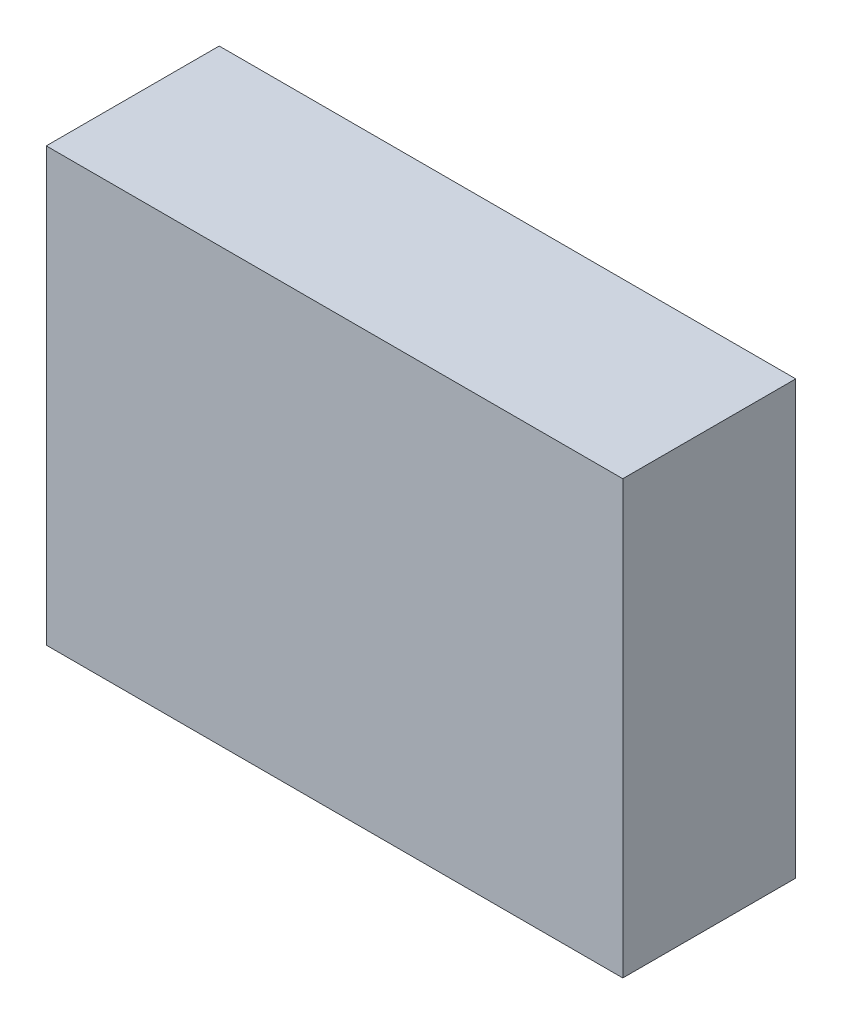
ISO-10303-21;
HEADER;
FILE_DESCRIPTION(('STEP AP214'),'2;1');
FILE_NAME('part.step','',(''),(''),'','','');
FILE_SCHEMA(('AUTOMOTIVE_DESIGN { 1 0 10303 214 1 1 1 1 }'));
ENDSEC;
DATA;
#1=APPLICATION_CONTEXT('core data for automotive mechanical design processes');
#2=APPLICATION_PROTOCOL_DEFINITION('international standard','automotive_design',2000,#1);
#3=PRODUCT_CONTEXT('',#1,'mechanical');
#4=PRODUCT('Part','Part','',(#3));
#5=PRODUCT_RELATED_PRODUCT_CATEGORY('part','',(#4));
#6=PRODUCT_DEFINITION_FORMATION('','',#4);
#7=PRODUCT_DEFINITION_CONTEXT('part definition',#1,'design');
#8=PRODUCT_DEFINITION('design','',#6,#7);
#9=PRODUCT_DEFINITION_SHAPE('','',#8);
#10=(LENGTH_UNIT() NAMED_UNIT(*) SI_UNIT(.MILLI.,.METRE.));
#11=(NAMED_UNIT(*) PLANE_ANGLE_UNIT() SI_UNIT($,.RADIAN.));
#12=(NAMED_UNIT(*) SI_UNIT($,.STERADIAN.) SOLID_ANGLE_UNIT());
#13=UNCERTAINTY_MEASURE_WITH_UNIT(LENGTH_MEASURE(1.E-05),#10,'distance_accuracy_value','');
#14=(GEOMETRIC_REPRESENTATION_CONTEXT(3) GLOBAL_UNCERTAINTY_ASSIGNED_CONTEXT((#13)) GLOBAL_UNIT_ASSIGNED_CONTEXT((#10,
#11,#12)) REPRESENTATION_CONTEXT('',''));
#15=CARTESIAN_POINT('',(0.,0.,0.));
#16=DIRECTION('',(0.,0.,1.));
#17=DIRECTION('',(1.,0.,0.));
#18=AXIS2_PLACEMENT_3D('',#15,#16,#17);
#19=CARTESIAN_POINT('',(-20.,15.,12.));
#20=DIRECTION('',(1.,0.,0.));
#21=DIRECTION('',(0.,0.,-1.));
#22=AXIS2_PLACEMENT_3D('',#19,#20,#21);
#23=PLANE('',#22);
#24=DIRECTION('',(0.,-1.,0.));
#25=VECTOR('',#24,1.);
#26=CARTESIAN_POINT('',(-20.,15.,0.));
#27=LINE('',#26,#25);
#28=CARTESIAN_POINT('',(-20.,15.,0.));
#29=VERTEX_POINT('',#28);
#30=CARTESIAN_POINT('',(-20.,-15.,0.));
#31=VERTEX_POINT('',#30);
#32=EDGE_CURVE('E102',#29,#31,#27,.T.);
#33=ORIENTED_EDGE('',*,*,#32,.T.);
#34=DIRECTION('',(0.,0.,-1.));
#35=VECTOR('',#34,1.);
#36=CARTESIAN_POINT('',(-20.,-15.,12.));
#37=LINE('',#36,#35);
#38=CARTESIAN_POINT('',(-20.,-15.,12.));
#39=VERTEX_POINT('',#38);
#40=EDGE_CURVE('E11',#39,#31,#37,.T.);
#41=ORIENTED_EDGE('',*,*,#40,.F.);
#42=DIRECTION('',(0.,-1.,0.));
#43=VECTOR('',#42,1.);
#44=CARTESIAN_POINT('',(-20.,15.,12.));
#45=LINE('',#44,#43);
#46=CARTESIAN_POINT('',(-20.,15.,12.));
#47=VERTEX_POINT('',#46);
#48=EDGE_CURVE('E90',#47,#39,#45,.T.);
#49=ORIENTED_EDGE('',*,*,#48,.F.);
#50=DIRECTION('',(0.,0.,-1.));
#51=VECTOR('',#50,1.);
#52=CARTESIAN_POINT('',(-20.,15.,12.));
#53=LINE('',#52,#51);
#54=EDGE_CURVE('E98',#47,#29,#53,.T.);
#55=ORIENTED_EDGE('',*,*,#54,.T.);
#56=EDGE_LOOP('',(#33,#41,#49,#55));
#57=FACE_BOUND('',#56,.T.);
#58=ADVANCED_FACE('F39',(#57),#23,.F.);
#59=CARTESIAN_POINT('',(-20.,-15.,12.));
#60=DIRECTION('',(0.,1.,0.));
#61=DIRECTION('',(0.,0.,1.));
#62=AXIS2_PLACEMENT_3D('',#59,#60,#61);
#63=PLANE('',#62);
#64=DIRECTION('',(1.,0.,0.));
#65=VECTOR('',#64,1.);
#66=CARTESIAN_POINT('',(-20.,-15.,0.));
#67=LINE('',#66,#65);
#68=CARTESIAN_POINT('',(20.,-15.,0.));
#69=VERTEX_POINT('',#68);
#70=EDGE_CURVE('E94',#31,#69,#67,.T.);
#71=ORIENTED_EDGE('',*,*,#70,.T.);
#72=DIRECTION('',(0.,0.,-1.));
#73=VECTOR('',#72,1.);
#74=CARTESIAN_POINT('',(20.,-15.,12.));
#75=LINE('',#74,#73);
#76=CARTESIAN_POINT('',(20.,-15.,12.));
#77=VERTEX_POINT('',#76);
#78=EDGE_CURVE('E47',#77,#69,#75,.T.);
#79=ORIENTED_EDGE('',*,*,#78,.F.);
#80=DIRECTION('',(1.,0.,0.));
#81=VECTOR('',#80,1.);
#82=CARTESIAN_POINT('',(-20.,-15.,12.));
#83=LINE('',#82,#81);
#84=EDGE_CURVE('E85',#39,#77,#83,.T.);
#85=ORIENTED_EDGE('',*,*,#84,.F.);
#86=ORIENTED_EDGE('',*,*,#40,.T.);
#87=EDGE_LOOP('',(#71,#79,#85,#86));
#88=FACE_BOUND('',#87,.T.);
#89=ADVANCED_FACE('F93',(#88),#63,.F.);
#90=CARTESIAN_POINT('',(20.,-15.,12.));
#91=DIRECTION('',(-1.,0.,0.));
#92=DIRECTION('',(0.,0.,1.));
#93=AXIS2_PLACEMENT_3D('',#90,#91,#92);
#94=PLANE('',#93);
#95=DIRECTION('',(0.,1.,0.));
#96=VECTOR('',#95,1.);
#97=CARTESIAN_POINT('',(20.,-15.,0.));
#98=LINE('',#97,#96);
#99=CARTESIAN_POINT('',(20.,15.,0.));
#100=VERTEX_POINT('',#99);
#101=EDGE_CURVE('E72',#69,#100,#98,.T.);
#102=ORIENTED_EDGE('',*,*,#101,.T.);
#103=DIRECTION('',(0.,0.,-1.));
#104=VECTOR('',#103,1.);
#105=CARTESIAN_POINT('',(20.,15.,12.));
#106=LINE('',#105,#104);
#107=CARTESIAN_POINT('',(20.,15.,12.));
#108=VERTEX_POINT('',#107);
#109=EDGE_CURVE('E95',#108,#100,#106,.T.);
#110=ORIENTED_EDGE('',*,*,#109,.F.);
#111=DIRECTION('',(0.,1.,0.));
#112=VECTOR('',#111,1.);
#113=CARTESIAN_POINT('',(20.,-15.,12.));
#114=LINE('',#113,#112);
#115=EDGE_CURVE('E88',#77,#108,#114,.T.);
#116=ORIENTED_EDGE('',*,*,#115,.F.);
#117=ORIENTED_EDGE('',*,*,#78,.T.);
#118=EDGE_LOOP('',(#102,#110,#116,#117));
#119=FACE_BOUND('',#118,.T.);
#120=ADVANCED_FACE('F96',(#119),#94,.F.);
#121=CARTESIAN_POINT('',(20.,15.,12.));
#122=DIRECTION('',(0.,-1.,0.));
#123=DIRECTION('',(0.,0.,-1.));
#124=AXIS2_PLACEMENT_3D('',#121,#122,#123);
#125=PLANE('',#124);
#126=DIRECTION('',(-1.,0.,0.));
#127=VECTOR('',#126,1.);
#128=CARTESIAN_POINT('',(20.,15.,0.));
#129=LINE('',#128,#127);
#130=EDGE_CURVE('E78',#100,#29,#129,.T.);
#131=ORIENTED_EDGE('',*,*,#130,.T.);
#132=ORIENTED_EDGE('',*,*,#54,.F.);
#133=DIRECTION('',(-1.,0.,0.));
#134=VECTOR('',#133,1.);
#135=CARTESIAN_POINT('',(20.,15.,12.));
#136=LINE('',#135,#134);
#137=EDGE_CURVE('E55',#108,#47,#136,.T.);
#138=ORIENTED_EDGE('',*,*,#137,.F.);
#139=ORIENTED_EDGE('',*,*,#109,.T.);
#140=EDGE_LOOP('',(#131,#132,#138,#139));
#141=FACE_BOUND('',#140,.T.);
#142=ADVANCED_FACE('F109',(#141),#125,.F.);
#143=CARTESIAN_POINT('',(0.,0.,12.));
#144=DIRECTION('',(0.,0.,1.));
#145=DIRECTION('',(1.,0.,0.));
#146=AXIS2_PLACEMENT_3D('',#143,#144,#145);
#147=PLANE('',#146);
#148=ORIENTED_EDGE('',*,*,#48,.T.);
#149=ORIENTED_EDGE('',*,*,#84,.T.);
#150=ORIENTED_EDGE('',*,*,#115,.T.);
#151=ORIENTED_EDGE('',*,*,#137,.T.);
#152=EDGE_LOOP('',(#148,#149,#150,#151));
#153=FACE_BOUND('',#152,.T.);
#154=ADVANCED_FACE('F86',(#153),#147,.T.);
#155=CARTESIAN_POINT('',(0.,0.,0.));
#156=DIRECTION('',(0.,0.,1.));
#157=DIRECTION('',(1.,0.,0.));
#158=AXIS2_PLACEMENT_3D('',#155,#156,#157);
#159=PLANE('',#158);
#160=ORIENTED_EDGE('',*,*,#32,.F.);
#161=ORIENTED_EDGE('',*,*,#130,.F.);
#162=ORIENTED_EDGE('',*,*,#101,.F.);
#163=ORIENTED_EDGE('',*,*,#70,.F.);
#164=EDGE_LOOP('',(#160,#161,#162,#163));
#165=FACE_BOUND('',#164,.T.);
#166=ADVANCED_FACE('F112',(#165),#159,.F.);
#167=CLOSED_SHELL('',(#58,#89,#120,#142,#154,#166));
#168=MANIFOLD_SOLID_BREP('B2',#167);
#169=ADVANCED_BREP_SHAPE_REPRESENTATION('',(#18,#168),#14);
#170=SHAPE_DEFINITION_REPRESENTATION(#9,#169);
ENDSEC;
END-ISO-10303-21;
